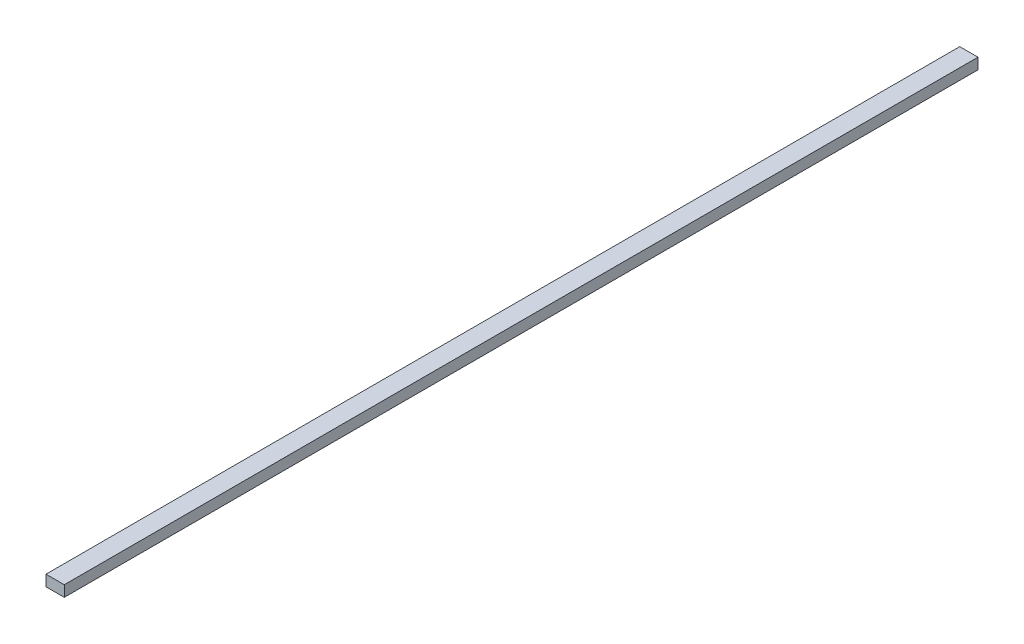
ISO-10303-21;
HEADER;
FILE_DESCRIPTION(('STEP AP214'),'2;1');
FILE_NAME('part.step','',(''),(''),'','','');
FILE_SCHEMA(('AUTOMOTIVE_DESIGN { 1 0 10303 214 1 1 1 1 }'));
ENDSEC;
DATA;
#1=APPLICATION_CONTEXT('core data for automotive mechanical design processes');
#2=APPLICATION_PROTOCOL_DEFINITION('international standard','automotive_design',2000,#1);
#3=PRODUCT_CONTEXT('',#1,'mechanical');
#4=PRODUCT('Part','Part','',(#3));
#5=PRODUCT_RELATED_PRODUCT_CATEGORY('part','',(#4));
#6=PRODUCT_DEFINITION_FORMATION('','',#4);
#7=PRODUCT_DEFINITION_CONTEXT('part definition',#1,'design');
#8=PRODUCT_DEFINITION('design','',#6,#7);
#9=PRODUCT_DEFINITION_SHAPE('','',#8);
#10=(LENGTH_UNIT() NAMED_UNIT(*) SI_UNIT(.MILLI.,.METRE.));
#11=(NAMED_UNIT(*) PLANE_ANGLE_UNIT() SI_UNIT($,.RADIAN.));
#12=(NAMED_UNIT(*) SI_UNIT($,.STERADIAN.) SOLID_ANGLE_UNIT());
#13=UNCERTAINTY_MEASURE_WITH_UNIT(LENGTH_MEASURE(1.E-05),#10,'distance_accuracy_value','');
#14=(GEOMETRIC_REPRESENTATION_CONTEXT(3) GLOBAL_UNCERTAINTY_ASSIGNED_CONTEXT((#13)) GLOBAL_UNIT_ASSIGNED_CONTEXT((#10,
#11,#12)) REPRESENTATION_CONTEXT('',''));
#15=CARTESIAN_POINT('',(0.,0.,0.));
#16=DIRECTION('',(0.,0.,1.));
#17=DIRECTION('',(1.,0.,0.));
#18=AXIS2_PLACEMENT_3D('',#15,#16,#17);
#19=CARTESIAN_POINT('',(0.,0.,-2500.));
#20=DIRECTION('',(-1.,0.,0.));
#21=DIRECTION('',(0.,0.,1.));
#22=AXIS2_PLACEMENT_3D('',#19,#20,#21);
#23=PLANE('',#22);
#24=DIRECTION('',(0.,-1.,0.));
#25=VECTOR('',#24,1.);
#26=CARTESIAN_POINT('',(0.,0.,0.));
#27=LINE('',#26,#25);
#28=CARTESIAN_POINT('',(0.,30.,0.));
#29=VERTEX_POINT('',#28);
#30=CARTESIAN_POINT('',(0.,0.,0.));
#31=VERTEX_POINT('',#30);
#32=EDGE_CURVE('E101',#29,#31,#27,.T.);
#33=ORIENTED_EDGE('',*,*,#32,.F.);
#34=DIRECTION('',(0.,0.,1.));
#35=VECTOR('',#34,1.);
#36=CARTESIAN_POINT('',(0.,30.,-2500.));
#37=LINE('',#36,#35);
#38=CARTESIAN_POINT('',(0.,30.,-2500.));
#39=VERTEX_POINT('',#38);
#40=EDGE_CURVE('E11',#39,#29,#37,.T.);
#41=ORIENTED_EDGE('',*,*,#40,.F.);
#42=DIRECTION('',(0.,-1.,0.));
#43=VECTOR('',#42,1.);
#44=CARTESIAN_POINT('',(0.,0.,-2500.));
#45=LINE('',#44,#43);
#46=CARTESIAN_POINT('',(0.,0.,-2500.));
#47=VERTEX_POINT('',#46);
#48=EDGE_CURVE('E95',#39,#47,#45,.T.);
#49=ORIENTED_EDGE('',*,*,#48,.T.);
#50=DIRECTION('',(0.,0.,1.));
#51=VECTOR('',#50,1.);
#52=CARTESIAN_POINT('',(0.,0.,-2500.));
#53=LINE('',#52,#51);
#54=EDGE_CURVE('E40',#47,#31,#53,.T.);
#55=ORIENTED_EDGE('',*,*,#54,.T.);
#56=EDGE_LOOP('',(#33,#41,#49,#55));
#57=FACE_BOUND('',#56,.T.);
#58=ADVANCED_FACE('F37',(#57),#23,.T.);
#59=CARTESIAN_POINT('',(0.,30.,-2500.));
#60=DIRECTION('',(0.,1.,0.));
#61=DIRECTION('',(0.,0.,1.));
#62=AXIS2_PLACEMENT_3D('',#59,#60,#61);
#63=PLANE('',#62);
#64=DIRECTION('',(-1.,0.,0.));
#65=VECTOR('',#64,1.);
#66=CARTESIAN_POINT('',(0.,30.,0.));
#67=LINE('',#66,#65);
#68=CARTESIAN_POINT('',(50.,30.,0.));
#69=VERTEX_POINT('',#68);
#70=EDGE_CURVE('E97',#69,#29,#67,.T.);
#71=ORIENTED_EDGE('',*,*,#70,.F.);
#72=DIRECTION('',(0.,0.,1.));
#73=VECTOR('',#72,1.);
#74=CARTESIAN_POINT('',(50.,30.,-2500.));
#75=LINE('',#74,#73);
#76=CARTESIAN_POINT('',(50.,30.,-2500.));
#77=VERTEX_POINT('',#76);
#78=EDGE_CURVE('E46',#77,#69,#75,.T.);
#79=ORIENTED_EDGE('',*,*,#78,.F.);
#80=DIRECTION('',(-1.,0.,0.));
#81=VECTOR('',#80,1.);
#82=CARTESIAN_POINT('',(0.,30.,-2500.));
#83=LINE('',#82,#81);
#84=EDGE_CURVE('E92',#77,#39,#83,.T.);
#85=ORIENTED_EDGE('',*,*,#84,.T.);
#86=ORIENTED_EDGE('',*,*,#40,.T.);
#87=EDGE_LOOP('',(#71,#79,#85,#86));
#88=FACE_BOUND('',#87,.T.);
#89=ADVANCED_FACE('F111',(#88),#63,.T.);
#90=CARTESIAN_POINT('',(50.,0.,-2500.));
#91=DIRECTION('',(1.,0.,0.));
#92=DIRECTION('',(0.,0.,-1.));
#93=AXIS2_PLACEMENT_3D('',#90,#91,#92);
#94=PLANE('',#93);
#95=DIRECTION('',(0.,1.,0.));
#96=VECTOR('',#95,1.);
#97=CARTESIAN_POINT('',(50.,0.,0.));
#98=LINE('',#97,#96);
#99=CARTESIAN_POINT('',(50.,0.,0.));
#100=VERTEX_POINT('',#99);
#101=EDGE_CURVE('E87',#100,#69,#98,.T.);
#102=ORIENTED_EDGE('',*,*,#101,.F.);
#103=DIRECTION('',(0.,0.,1.));
#104=VECTOR('',#103,1.);
#105=CARTESIAN_POINT('',(50.,0.,-2500.));
#106=LINE('',#105,#104);
#107=CARTESIAN_POINT('',(50.,0.,-2500.));
#108=VERTEX_POINT('',#107);
#109=EDGE_CURVE('E82',#108,#100,#106,.T.);
#110=ORIENTED_EDGE('',*,*,#109,.F.);
#111=DIRECTION('',(0.,1.,0.));
#112=VECTOR('',#111,1.);
#113=CARTESIAN_POINT('',(50.,0.,-2500.));
#114=LINE('',#113,#112);
#115=EDGE_CURVE('E85',#108,#77,#114,.T.);
#116=ORIENTED_EDGE('',*,*,#115,.T.);
#117=ORIENTED_EDGE('',*,*,#78,.T.);
#118=EDGE_LOOP('',(#102,#110,#116,#117));
#119=FACE_BOUND('',#118,.T.);
#120=ADVANCED_FACE('F84',(#119),#94,.T.);
#121=CARTESIAN_POINT('',(0.,0.,-2500.));
#122=DIRECTION('',(0.,-1.,0.));
#123=DIRECTION('',(0.,0.,-1.));
#124=AXIS2_PLACEMENT_3D('',#121,#122,#123);
#125=PLANE('',#124);
#126=DIRECTION('',(1.,0.,0.));
#127=VECTOR('',#126,1.);
#128=CARTESIAN_POINT('',(0.,0.,0.));
#129=LINE('',#128,#127);
#130=EDGE_CURVE('E104',#31,#100,#129,.T.);
#131=ORIENTED_EDGE('',*,*,#130,.F.);
#132=ORIENTED_EDGE('',*,*,#54,.F.);
#133=DIRECTION('',(1.,0.,0.));
#134=VECTOR('',#133,1.);
#135=CARTESIAN_POINT('',(0.,0.,-2500.));
#136=LINE('',#135,#134);
#137=EDGE_CURVE('E91',#47,#108,#136,.T.);
#138=ORIENTED_EDGE('',*,*,#137,.T.);
#139=ORIENTED_EDGE('',*,*,#109,.T.);
#140=EDGE_LOOP('',(#131,#132,#138,#139));
#141=FACE_BOUND('',#140,.T.);
#142=ADVANCED_FACE('F94',(#141),#125,.T.);
#143=CARTESIAN_POINT('',(0.,0.,-2500.));
#144=DIRECTION('',(0.,0.,-1.));
#145=DIRECTION('',(-1.,0.,0.));
#146=AXIS2_PLACEMENT_3D('',#143,#144,#145);
#147=PLANE('',#146);
#148=ORIENTED_EDGE('',*,*,#48,.F.);
#149=ORIENTED_EDGE('',*,*,#84,.F.);
#150=ORIENTED_EDGE('',*,*,#115,.F.);
#151=ORIENTED_EDGE('',*,*,#137,.F.);
#152=EDGE_LOOP('',(#148,#149,#150,#151));
#153=FACE_BOUND('',#152,.T.);
#154=ADVANCED_FACE('F90',(#153),#147,.T.);
#155=CARTESIAN_POINT('',(0.,0.,0.));
#156=DIRECTION('',(0.,0.,-1.));
#157=DIRECTION('',(-1.,0.,0.));
#158=AXIS2_PLACEMENT_3D('',#155,#156,#157);
#159=PLANE('',#158);
#160=ORIENTED_EDGE('',*,*,#32,.T.);
#161=ORIENTED_EDGE('',*,*,#130,.T.);
#162=ORIENTED_EDGE('',*,*,#101,.T.);
#163=ORIENTED_EDGE('',*,*,#70,.T.);
#164=EDGE_LOOP('',(#160,#161,#162,#163));
#165=FACE_BOUND('',#164,.T.);
#166=ADVANCED_FACE('F110',(#165),#159,.F.);
#167=CLOSED_SHELL('',(#58,#89,#120,#142,#154,#166));
#168=MANIFOLD_SOLID_BREP('B2',#167);
#169=ADVANCED_BREP_SHAPE_REPRESENTATION('',(#18,#168),#14);
#170=SHAPE_DEFINITION_REPRESENTATION(#9,#169);
ENDSEC;
END-ISO-10303-21;
